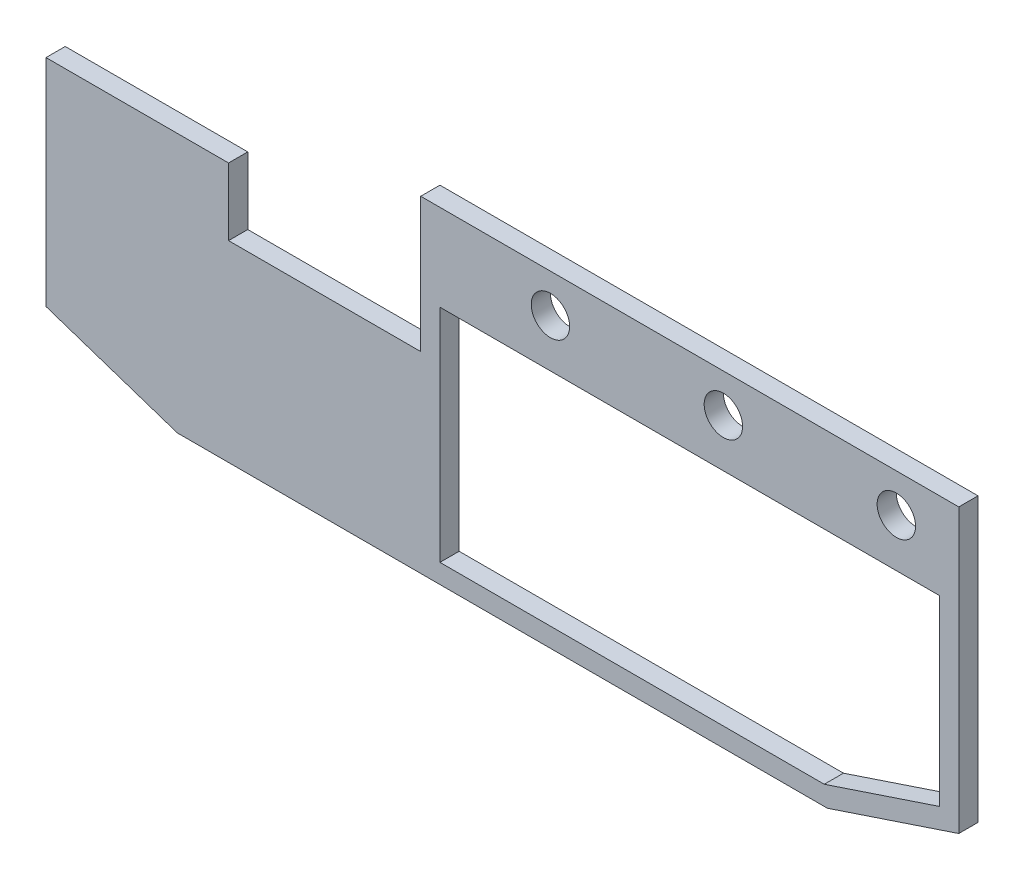
ISO-10303-21;
HEADER;
FILE_DESCRIPTION(('STEP AP214'),'2;1');
FILE_NAME('part.step','',(''),(''),'','','');
FILE_SCHEMA(('AUTOMOTIVE_DESIGN { 1 0 10303 214 1 1 1 1 }'));
ENDSEC;
DATA;
#1=APPLICATION_CONTEXT('core data for automotive mechanical design processes');
#2=APPLICATION_PROTOCOL_DEFINITION('international standard','automotive_design',2000,#1);
#3=PRODUCT_CONTEXT('',#1,'mechanical');
#4=PRODUCT('Part','Part','',(#3));
#5=PRODUCT_RELATED_PRODUCT_CATEGORY('part','',(#4));
#6=PRODUCT_DEFINITION_FORMATION('','',#4);
#7=PRODUCT_DEFINITION_CONTEXT('part definition',#1,'design');
#8=PRODUCT_DEFINITION('design','',#6,#7);
#9=PRODUCT_DEFINITION_SHAPE('','',#8);
#10=(LENGTH_UNIT() NAMED_UNIT(*) SI_UNIT(.MILLI.,.METRE.));
#11=(NAMED_UNIT(*) PLANE_ANGLE_UNIT() SI_UNIT($,.RADIAN.));
#12=(NAMED_UNIT(*) SI_UNIT($,.STERADIAN.) SOLID_ANGLE_UNIT());
#13=UNCERTAINTY_MEASURE_WITH_UNIT(LENGTH_MEASURE(1.E-05),#10,'distance_accuracy_value','');
#14=(GEOMETRIC_REPRESENTATION_CONTEXT(3) GLOBAL_UNCERTAINTY_ASSIGNED_CONTEXT((#13)) GLOBAL_UNIT_ASSIGNED_CONTEXT((#10,
#11,#12)) REPRESENTATION_CONTEXT('',''));
#15=CARTESIAN_POINT('',(0.,0.,0.));
#16=DIRECTION('',(0.,0.,1.));
#17=DIRECTION('',(1.,0.,0.));
#18=AXIS2_PLACEMENT_3D('',#15,#16,#17);
#19=CARTESIAN_POINT('',(2.,-20.4415184401123,-2.));
#20=DIRECTION('',(1.,0.,0.));
#21=DIRECTION('',(0.,0.,-1.));
#22=AXIS2_PLACEMENT_3D('',#19,#20,#21);
#23=PLANE('',#22);
#24=DIRECTION('',(0.,1.,0.));
#25=VECTOR('',#24,1.);
#26=CARTESIAN_POINT('',(2.,-20.4415184401123,0.));
#27=LINE('',#26,#25);
#28=CARTESIAN_POINT('',(2.,-20.4415184401123,0.));
#29=VERTEX_POINT('',#28);
#30=CARTESIAN_POINT('',(2.,9.,0.));
#31=VERTEX_POINT('',#30);
#32=EDGE_CURVE('E223',#29,#31,#27,.T.);
#33=ORIENTED_EDGE('',*,*,#32,.F.);
#34=DIRECTION('',(0.,0.,1.));
#35=VECTOR('',#34,1.);
#36=CARTESIAN_POINT('',(2.,-20.4415184401123,-2.));
#37=LINE('',#36,#35);
#38=CARTESIAN_POINT('',(2.,-20.4415184401123,-2.));
#39=VERTEX_POINT('',#38);
#40=EDGE_CURVE('E11',#39,#29,#37,.T.);
#41=ORIENTED_EDGE('',*,*,#40,.F.);
#42=DIRECTION('',(0.,1.,0.));
#43=VECTOR('',#42,1.);
#44=CARTESIAN_POINT('',(2.,-20.4415184401123,-2.));
#45=LINE('',#44,#43);
#46=CARTESIAN_POINT('',(2.,9.,-2.));
#47=VERTEX_POINT('',#46);
#48=EDGE_CURVE('E224',#39,#47,#45,.T.);
#49=ORIENTED_EDGE('',*,*,#48,.T.);
#50=DIRECTION('',(0.,0.,1.));
#51=VECTOR('',#50,1.);
#52=CARTESIAN_POINT('',(2.,9.,-2.));
#53=LINE('',#52,#51);
#54=EDGE_CURVE('E42',#47,#31,#53,.T.);
#55=ORIENTED_EDGE('',*,*,#54,.T.);
#56=EDGE_LOOP('',(#33,#41,#49,#55));
#57=FACE_BOUND('',#56,.T.);
#58=ADVANCED_FACE('F39',(#57),#23,.T.);
#59=CARTESIAN_POINT('',(-11.6754446796632,-25.,-2.));
#60=DIRECTION('',(0.316227766016838,-0.948683298050514,0.));
#61=DIRECTION('',(0.948683298050514,0.316227766016838,0.));
#62=AXIS2_PLACEMENT_3D('',#59,#60,#61);
#63=PLANE('',#62);
#64=DIRECTION('',(0.948683298050514,0.316227766016838,0.));
#65=VECTOR('',#64,1.);
#66=CARTESIAN_POINT('',(-11.6754446796632,-25.,0.));
#67=LINE('',#66,#65);
#68=CARTESIAN_POINT('',(-11.6754446796632,-25.,0.));
#69=VERTEX_POINT('',#68);
#70=EDGE_CURVE('E229',#69,#29,#67,.T.);
#71=ORIENTED_EDGE('',*,*,#70,.F.);
#72=DIRECTION('',(0.,0.,1.));
#73=VECTOR('',#72,1.);
#74=CARTESIAN_POINT('',(-11.6754446796632,-25.,-2.));
#75=LINE('',#74,#73);
#76=CARTESIAN_POINT('',(-11.6754446796632,-25.,-2.));
#77=VERTEX_POINT('',#76);
#78=EDGE_CURVE('E48',#77,#69,#75,.T.);
#79=ORIENTED_EDGE('',*,*,#78,.F.);
#80=DIRECTION('',(0.948683298050514,0.316227766016838,0.));
#81=VECTOR('',#80,1.);
#82=CARTESIAN_POINT('',(-11.6754446796632,-25.,-2.));
#83=LINE('',#82,#81);
#84=EDGE_CURVE('E261',#77,#39,#83,.T.);
#85=ORIENTED_EDGE('',*,*,#84,.T.);
#86=ORIENTED_EDGE('',*,*,#40,.T.);
#87=EDGE_LOOP('',(#71,#79,#85,#86));
#88=FACE_BOUND('',#87,.T.);
#89=ADVANCED_FACE('F338',(#88),#63,.T.);
#90=CARTESIAN_POINT('',(-79.3245553203368,-25.,-2.));
#91=DIRECTION('',(0.,-1.,0.));
#92=DIRECTION('',(0.,0.,-1.));
#93=AXIS2_PLACEMENT_3D('',#90,#91,#92);
#94=PLANE('',#93);
#95=DIRECTION('',(1.,0.,0.));
#96=VECTOR('',#95,1.);
#97=CARTESIAN_POINT('',(-79.3245553203368,-25.,0.));
#98=LINE('',#97,#96);
#99=CARTESIAN_POINT('',(-79.3245553203368,-25.,0.));
#100=VERTEX_POINT('',#99);
#101=EDGE_CURVE('E296',#100,#69,#98,.T.);
#102=ORIENTED_EDGE('',*,*,#101,.F.);
#103=DIRECTION('',(0.,0.,1.));
#104=VECTOR('',#103,1.);
#105=CARTESIAN_POINT('',(-79.3245553203368,-25.,-2.));
#106=LINE('',#105,#104);
#107=CARTESIAN_POINT('',(-79.3245553203368,-25.,-2.));
#108=VERTEX_POINT('',#107);
#109=EDGE_CURVE('E305',#108,#100,#106,.T.);
#110=ORIENTED_EDGE('',*,*,#109,.F.);
#111=DIRECTION('',(1.,0.,0.));
#112=VECTOR('',#111,1.);
#113=CARTESIAN_POINT('',(-79.3245553203368,-25.,-2.));
#114=LINE('',#113,#112);
#115=EDGE_CURVE('E257',#108,#77,#114,.T.);
#116=ORIENTED_EDGE('',*,*,#115,.T.);
#117=ORIENTED_EDGE('',*,*,#78,.T.);
#118=EDGE_LOOP('',(#102,#110,#116,#117));
#119=FACE_BOUND('',#118,.T.);
#120=ADVANCED_FACE('F366',(#119),#94,.T.);
#121=CARTESIAN_POINT('',(-93.,-20.4415184401123,-2.));
#122=DIRECTION('',(-0.316227766016838,-0.948683298050514,0.));
#123=DIRECTION('',(0.948683298050514,-0.316227766016838,0.));
#124=AXIS2_PLACEMENT_3D('',#121,#122,#123);
#125=PLANE('',#124);
#126=DIRECTION('',(0.948683298050514,-0.316227766016838,0.));
#127=VECTOR('',#126,1.);
#128=CARTESIAN_POINT('',(-93.,-20.4415184401123,0.));
#129=LINE('',#128,#127);
#130=CARTESIAN_POINT('',(-93.,-20.4415184401123,0.));
#131=VERTEX_POINT('',#130);
#132=EDGE_CURVE('E292',#131,#100,#129,.T.);
#133=ORIENTED_EDGE('',*,*,#132,.F.);
#134=DIRECTION('',(0.,0.,1.));
#135=VECTOR('',#134,1.);
#136=CARTESIAN_POINT('',(-93.,-20.4415184401123,-2.));
#137=LINE('',#136,#135);
#138=CARTESIAN_POINT('',(-93.,-20.4415184401123,-2.));
#139=VERTEX_POINT('',#138);
#140=EDGE_CURVE('E308',#139,#131,#137,.T.);
#141=ORIENTED_EDGE('',*,*,#140,.F.);
#142=DIRECTION('',(0.948683298050514,-0.316227766016838,0.));
#143=VECTOR('',#142,1.);
#144=CARTESIAN_POINT('',(-93.,-20.4415184401123,-2.));
#145=LINE('',#144,#143);
#146=EDGE_CURVE('E253',#139,#108,#145,.T.);
#147=ORIENTED_EDGE('',*,*,#146,.T.);
#148=ORIENTED_EDGE('',*,*,#109,.T.);
#149=EDGE_LOOP('',(#133,#141,#147,#148));
#150=FACE_BOUND('',#149,.T.);
#151=ADVANCED_FACE('F364',(#150),#125,.T.);
#152=CARTESIAN_POINT('',(-93.,2.,-2.));
#153=DIRECTION('',(-1.,0.,0.));
#154=DIRECTION('',(0.,0.,1.));
#155=AXIS2_PLACEMENT_3D('',#152,#153,#154);
#156=PLANE('',#155);
#157=DIRECTION('',(0.,-1.,0.));
#158=VECTOR('',#157,1.);
#159=CARTESIAN_POINT('',(-93.,2.,0.));
#160=LINE('',#159,#158);
#161=CARTESIAN_POINT('',(-93.,2.,0.));
#162=VERTEX_POINT('',#161);
#163=EDGE_CURVE('E288',#162,#131,#160,.T.);
#164=ORIENTED_EDGE('',*,*,#163,.F.);
#165=DIRECTION('',(0.,0.,1.));
#166=VECTOR('',#165,1.);
#167=CARTESIAN_POINT('',(-93.,2.,-2.));
#168=LINE('',#167,#166);
#169=CARTESIAN_POINT('',(-93.,2.,-2.));
#170=VERTEX_POINT('',#169);
#171=EDGE_CURVE('E311',#170,#162,#168,.T.);
#172=ORIENTED_EDGE('',*,*,#171,.F.);
#173=DIRECTION('',(0.,-1.,0.));
#174=VECTOR('',#173,1.);
#175=CARTESIAN_POINT('',(-93.,2.,-2.));
#176=LINE('',#175,#174);
#177=EDGE_CURVE('E249',#170,#139,#176,.T.);
#178=ORIENTED_EDGE('',*,*,#177,.T.);
#179=ORIENTED_EDGE('',*,*,#140,.T.);
#180=EDGE_LOOP('',(#164,#172,#178,#179));
#181=FACE_BOUND('',#180,.T.);
#182=ADVANCED_FACE('F360',(#181),#156,.T.);
#183=CARTESIAN_POINT('',(-74.,2.,-2.));
#184=DIRECTION('',(0.,1.,0.));
#185=DIRECTION('',(-1.,0.,0.));
#186=AXIS2_PLACEMENT_3D('',#183,#184,#185);
#187=PLANE('',#186);
#188=DIRECTION('',(-1.,0.,0.));
#189=VECTOR('',#188,1.);
#190=CARTESIAN_POINT('',(-74.,2.,0.));
#191=LINE('',#190,#189);
#192=CARTESIAN_POINT('',(-74.,2.,0.));
#193=VERTEX_POINT('',#192);
#194=EDGE_CURVE('E284',#193,#162,#191,.T.);
#195=ORIENTED_EDGE('',*,*,#194,.F.);
#196=DIRECTION('',(0.,0.,1.));
#197=VECTOR('',#196,1.);
#198=CARTESIAN_POINT('',(-74.,2.,-2.));
#199=LINE('',#198,#197);
#200=CARTESIAN_POINT('',(-74.,2.,-2.));
#201=VERTEX_POINT('',#200);
#202=EDGE_CURVE('E314',#201,#193,#199,.T.);
#203=ORIENTED_EDGE('',*,*,#202,.F.);
#204=DIRECTION('',(-1.,0.,0.));
#205=VECTOR('',#204,1.);
#206=CARTESIAN_POINT('',(-74.,2.,-2.));
#207=LINE('',#206,#205);
#208=EDGE_CURVE('E245',#201,#170,#207,.T.);
#209=ORIENTED_EDGE('',*,*,#208,.T.);
#210=ORIENTED_EDGE('',*,*,#171,.T.);
#211=EDGE_LOOP('',(#195,#203,#209,#210));
#212=FACE_BOUND('',#211,.T.);
#213=ADVANCED_FACE('F356',(#212),#187,.T.);
#214=CARTESIAN_POINT('',(-74.,-5.,-2.));
#215=DIRECTION('',(1.,0.,0.));
#216=DIRECTION('',(0.,0.,-1.));
#217=AXIS2_PLACEMENT_3D('',#214,#215,#216);
#218=PLANE('',#217);
#219=DIRECTION('',(0.,1.,0.));
#220=VECTOR('',#219,1.);
#221=CARTESIAN_POINT('',(-74.,-5.,0.));
#222=LINE('',#221,#220);
#223=CARTESIAN_POINT('',(-74.,-5.,0.));
#224=VERTEX_POINT('',#223);
#225=EDGE_CURVE('E280',#224,#193,#222,.T.);
#226=ORIENTED_EDGE('',*,*,#225,.F.);
#227=DIRECTION('',(0.,0.,1.));
#228=VECTOR('',#227,1.);
#229=CARTESIAN_POINT('',(-74.,-5.,-2.));
#230=LINE('',#229,#228);
#231=CARTESIAN_POINT('',(-74.,-5.,-2.));
#232=VERTEX_POINT('',#231);
#233=EDGE_CURVE('E317',#232,#224,#230,.T.);
#234=ORIENTED_EDGE('',*,*,#233,.F.);
#235=DIRECTION('',(0.,1.,0.));
#236=VECTOR('',#235,1.);
#237=CARTESIAN_POINT('',(-74.,-5.,-2.));
#238=LINE('',#237,#236);
#239=EDGE_CURVE('E241',#232,#201,#238,.T.);
#240=ORIENTED_EDGE('',*,*,#239,.T.);
#241=ORIENTED_EDGE('',*,*,#202,.T.);
#242=EDGE_LOOP('',(#226,#234,#240,#241));
#243=FACE_BOUND('',#242,.T.);
#244=ADVANCED_FACE('F352',(#243),#218,.T.);
#245=CARTESIAN_POINT('',(-54.,-5.,-2.));
#246=DIRECTION('',(0.,1.,0.));
#247=DIRECTION('',(-1.,0.,0.));
#248=AXIS2_PLACEMENT_3D('',#245,#246,#247);
#249=PLANE('',#248);
#250=DIRECTION('',(-1.,0.,0.));
#251=VECTOR('',#250,1.);
#252=CARTESIAN_POINT('',(-54.,-5.,0.));
#253=LINE('',#252,#251);
#254=CARTESIAN_POINT('',(-54.,-5.,0.));
#255=VERTEX_POINT('',#254);
#256=EDGE_CURVE('E276',#255,#224,#253,.T.);
#257=ORIENTED_EDGE('',*,*,#256,.F.);
#258=DIRECTION('',(0.,0.,1.));
#259=VECTOR('',#258,1.);
#260=CARTESIAN_POINT('',(-54.,-5.,-2.));
#261=LINE('',#260,#259);
#262=CARTESIAN_POINT('',(-54.,-5.,-2.));
#263=VERTEX_POINT('',#262);
#264=EDGE_CURVE('E320',#263,#255,#261,.T.);
#265=ORIENTED_EDGE('',*,*,#264,.F.);
#266=DIRECTION('',(-1.,0.,0.));
#267=VECTOR('',#266,1.);
#268=CARTESIAN_POINT('',(-54.,-5.,-2.));
#269=LINE('',#268,#267);
#270=EDGE_CURVE('E237',#263,#232,#269,.T.);
#271=ORIENTED_EDGE('',*,*,#270,.T.);
#272=ORIENTED_EDGE('',*,*,#233,.T.);
#273=EDGE_LOOP('',(#257,#265,#271,#272));
#274=FACE_BOUND('',#273,.T.);
#275=ADVANCED_FACE('F350',(#274),#249,.T.);
#276=CARTESIAN_POINT('',(-54.,8.99999999999999,-2.));
#277=DIRECTION('',(-1.,0.,0.));
#278=DIRECTION('',(0.,0.,1.));
#279=AXIS2_PLACEMENT_3D('',#276,#277,#278);
#280=PLANE('',#279);
#281=DIRECTION('',(0.,-1.,0.));
#282=VECTOR('',#281,1.);
#283=CARTESIAN_POINT('',(-54.,8.99999999999999,0.));
#284=LINE('',#283,#282);
#285=CARTESIAN_POINT('',(-54.,8.99999999999999,0.));
#286=VERTEX_POINT('',#285);
#287=EDGE_CURVE('E272',#286,#255,#284,.T.);
#288=ORIENTED_EDGE('',*,*,#287,.F.);
#289=DIRECTION('',(0.,0.,1.));
#290=VECTOR('',#289,1.);
#291=CARTESIAN_POINT('',(-54.,8.99999999999999,-2.));
#292=LINE('',#291,#290);
#293=CARTESIAN_POINT('',(-54.,8.99999999999999,-2.));
#294=VERTEX_POINT('',#293);
#295=EDGE_CURVE('E322',#294,#286,#292,.T.);
#296=ORIENTED_EDGE('',*,*,#295,.F.);
#297=DIRECTION('',(0.,-1.,0.));
#298=VECTOR('',#297,1.);
#299=CARTESIAN_POINT('',(-54.,8.99999999999999,-2.));
#300=LINE('',#299,#298);
#301=EDGE_CURVE('E233',#294,#263,#300,.T.);
#302=ORIENTED_EDGE('',*,*,#301,.T.);
#303=ORIENTED_EDGE('',*,*,#264,.T.);
#304=EDGE_LOOP('',(#288,#296,#302,#303));
#305=FACE_BOUND('',#304,.T.);
#306=ADVANCED_FACE('F346',(#305),#280,.T.);
#307=CARTESIAN_POINT('',(2.,9.,-2.));
#308=DIRECTION('',(0.,1.,0.));
#309=DIRECTION('',(-1.,0.,0.));
#310=AXIS2_PLACEMENT_3D('',#307,#308,#309);
#311=PLANE('',#310);
#312=DIRECTION('',(-1.,0.,0.));
#313=VECTOR('',#312,1.);
#314=CARTESIAN_POINT('',(2.,9.,0.));
#315=LINE('',#314,#313);
#316=EDGE_CURVE('E268',#31,#286,#315,.T.);
#317=ORIENTED_EDGE('',*,*,#316,.F.);
#318=ORIENTED_EDGE('',*,*,#54,.F.);
#319=DIRECTION('',(-1.,0.,0.));
#320=VECTOR('',#319,1.);
#321=CARTESIAN_POINT('',(2.,9.,-2.));
#322=LINE('',#321,#320);
#323=EDGE_CURVE('E228',#47,#294,#322,.T.);
#324=ORIENTED_EDGE('',*,*,#323,.T.);
#325=ORIENTED_EDGE('',*,*,#295,.T.);
#326=EDGE_LOOP('',(#317,#318,#324,#325));
#327=FACE_BOUND('',#326,.T.);
#328=ADVANCED_FACE('F332',(#327),#311,.T.);
#329=CARTESIAN_POINT('',(0.,0.,-2.));
#330=DIRECTION('',(0.,0.,1.));
#331=DIRECTION('',(1.,0.,0.));
#332=AXIS2_PLACEMENT_3D('',#329,#330,#331);
#333=PLANE('',#332);
#334=DIRECTION('',(0.,-1.,0.));
#335=VECTOR('',#334,1.);
#336=CARTESIAN_POINT('',(0.,0.,-2.));
#337=LINE('',#336,#335);
#338=CARTESIAN_POINT('',(0.,0.,-2.));
#339=VERTEX_POINT('',#338);
#340=CARTESIAN_POINT('',(0.,-19.,-2.));
#341=VERTEX_POINT('',#340);
#342=EDGE_CURVE('E170',#339,#341,#337,.T.);
#343=ORIENTED_EDGE('',*,*,#342,.F.);
#344=DIRECTION('',(1.,0.,0.));
#345=VECTOR('',#344,1.);
#346=CARTESIAN_POINT('',(-52.,0.,-2.));
#347=LINE('',#346,#345);
#348=CARTESIAN_POINT('',(-52.,0.,-2.));
#349=VERTEX_POINT('',#348);
#350=EDGE_CURVE('E152',#349,#339,#347,.T.);
#351=ORIENTED_EDGE('',*,*,#350,.F.);
#352=DIRECTION('',(0.,1.,0.));
#353=VECTOR('',#352,1.);
#354=CARTESIAN_POINT('',(-52.,-7.,-2.));
#355=LINE('',#354,#353);
#356=CARTESIAN_POINT('',(-52.,-23.,-2.));
#357=VERTEX_POINT('',#356);
#358=EDGE_CURVE('E64',#357,#349,#355,.T.);
#359=ORIENTED_EDGE('',*,*,#358,.F.);
#360=DIRECTION('',(-1.,0.,0.));
#361=VECTOR('',#360,1.);
#362=CARTESIAN_POINT('',(-12.,-23.,-2.));
#363=LINE('',#362,#361);
#364=CARTESIAN_POINT('',(-12.,-23.,-2.));
#365=VERTEX_POINT('',#364);
#366=EDGE_CURVE('E541',#365,#357,#363,.T.);
#367=ORIENTED_EDGE('',*,*,#366,.F.);
#368=DIRECTION('',(-0.948683298050514,-0.316227766016838,0.));
#369=VECTOR('',#368,1.);
#370=CARTESIAN_POINT('',(0.,-19.,-2.));
#371=LINE('',#370,#369);
#372=EDGE_CURVE('E176',#341,#365,#371,.T.);
#373=ORIENTED_EDGE('',*,*,#372,.F.);
#374=EDGE_LOOP('',(#343,#351,#359,#367,#373));
#375=FACE_BOUND('',#374,.T.);
#376=CARTESIAN_POINT('',(-40.5,5.,-2.));
#377=DIRECTION('',(0.,0.,1.));
#378=DIRECTION('',(1.,0.,0.));
#379=AXIS2_PLACEMENT_3D('',#376,#377,#378);
#380=CIRCLE('',#379,1.99999999999999);
#381=CARTESIAN_POINT('',(-38.5,5.,-2.));
#382=VERTEX_POINT('',#381);
#383=EDGE_CURVE('E203',#382,#382,#380,.T.);
#384=ORIENTED_EDGE('',*,*,#383,.T.);
#385=EDGE_LOOP('',(#384));
#386=FACE_BOUND('',#385,.T.);
#387=CARTESIAN_POINT('',(-22.5,5.,-2.));
#388=DIRECTION('',(0.,0.,1.));
#389=DIRECTION('',(1.,0.,0.));
#390=AXIS2_PLACEMENT_3D('',#387,#388,#389);
#391=CIRCLE('',#390,1.99999999999999);
#392=CARTESIAN_POINT('',(-20.5,5.,-2.));
#393=VERTEX_POINT('',#392);
#394=EDGE_CURVE('E211',#393,#393,#391,.T.);
#395=ORIENTED_EDGE('',*,*,#394,.T.);
#396=EDGE_LOOP('',(#395));
#397=FACE_BOUND('',#396,.T.);
#398=CARTESIAN_POINT('',(-4.5,5.,-2.));
#399=DIRECTION('',(0.,0.,1.));
#400=DIRECTION('',(1.,0.,0.));
#401=AXIS2_PLACEMENT_3D('',#398,#399,#400);
#402=CIRCLE('',#401,1.99999999999999);
#403=CARTESIAN_POINT('',(-2.5,5.,-2.));
#404=VERTEX_POINT('',#403);
#405=EDGE_CURVE('E219',#404,#404,#402,.T.);
#406=ORIENTED_EDGE('',*,*,#405,.T.);
#407=EDGE_LOOP('',(#406));
#408=FACE_BOUND('',#407,.T.);
#409=ORIENTED_EDGE('',*,*,#48,.F.);
#410=ORIENTED_EDGE('',*,*,#84,.F.);
#411=ORIENTED_EDGE('',*,*,#115,.F.);
#412=ORIENTED_EDGE('',*,*,#146,.F.);
#413=ORIENTED_EDGE('',*,*,#177,.F.);
#414=ORIENTED_EDGE('',*,*,#208,.F.);
#415=ORIENTED_EDGE('',*,*,#239,.F.);
#416=ORIENTED_EDGE('',*,*,#270,.F.);
#417=ORIENTED_EDGE('',*,*,#301,.F.);
#418=ORIENTED_EDGE('',*,*,#323,.F.);
#419=EDGE_LOOP('',(#409,#410,#411,#412,#413,#414,#415,#416,#417,#418));
#420=FACE_BOUND('',#419,.T.);
#421=ADVANCED_FACE('F166',(#375,#386,#397,#408,#420),#333,.F.);
#422=CARTESIAN_POINT('',(0.,0.,0.));
#423=DIRECTION('',(0.,0.,1.));
#424=DIRECTION('',(1.,0.,0.));
#425=AXIS2_PLACEMENT_3D('',#422,#423,#424);
#426=PLANE('',#425);
#427=DIRECTION('',(1.,0.,0.));
#428=VECTOR('',#427,1.);
#429=CARTESIAN_POINT('',(-12.,-23.,0.));
#430=LINE('',#429,#428);
#431=CARTESIAN_POINT('',(-52.,-23.,0.));
#432=VERTEX_POINT('',#431);
#433=CARTESIAN_POINT('',(-12.,-23.,0.));
#434=VERTEX_POINT('',#433);
#435=EDGE_CURVE('E182',#432,#434,#430,.T.);
#436=ORIENTED_EDGE('',*,*,#435,.F.);
#437=DIRECTION('',(0.,-1.,0.));
#438=VECTOR('',#437,1.);
#439=CARTESIAN_POINT('',(-52.,-7.,0.));
#440=LINE('',#439,#438);
#441=CARTESIAN_POINT('',(-52.,0.,0.));
#442=VERTEX_POINT('',#441);
#443=EDGE_CURVE('E56',#442,#432,#440,.T.);
#444=ORIENTED_EDGE('',*,*,#443,.F.);
#445=DIRECTION('',(-1.,0.,0.));
#446=VECTOR('',#445,1.);
#447=CARTESIAN_POINT('',(-52.,0.,0.));
#448=LINE('',#447,#446);
#449=CARTESIAN_POINT('',(0.,0.,0.));
#450=VERTEX_POINT('',#449);
#451=EDGE_CURVE('E155',#450,#442,#448,.T.);
#452=ORIENTED_EDGE('',*,*,#451,.F.);
#453=DIRECTION('',(0.,1.,0.));
#454=VECTOR('',#453,1.);
#455=CARTESIAN_POINT('',(0.,0.,0.));
#456=LINE('',#455,#454);
#457=CARTESIAN_POINT('',(0.,-19.,0.));
#458=VERTEX_POINT('',#457);
#459=EDGE_CURVE('E158',#458,#450,#456,.T.);
#460=ORIENTED_EDGE('',*,*,#459,.F.);
#461=DIRECTION('',(0.948683298050514,0.316227766016838,0.));
#462=VECTOR('',#461,1.);
#463=CARTESIAN_POINT('',(0.,-19.,0.));
#464=LINE('',#463,#462);
#465=EDGE_CURVE('E185',#434,#458,#464,.T.);
#466=ORIENTED_EDGE('',*,*,#465,.F.);
#467=EDGE_LOOP('',(#436,#444,#452,#460,#466));
#468=FACE_BOUND('',#467,.T.);
#469=CARTESIAN_POINT('',(-40.5,5.,0.));
#470=DIRECTION('',(0.,0.,1.));
#471=DIRECTION('',(1.,0.,0.));
#472=AXIS2_PLACEMENT_3D('',#469,#470,#471);
#473=CIRCLE('',#472,1.99999999999999);
#474=CARTESIAN_POINT('',(-38.5,5.,0.));
#475=VERTEX_POINT('',#474);
#476=EDGE_CURVE('E163',#475,#475,#473,.T.);
#477=ORIENTED_EDGE('',*,*,#476,.F.);
#478=EDGE_LOOP('',(#477));
#479=FACE_BOUND('',#478,.T.);
#480=CARTESIAN_POINT('',(-22.5,5.,0.));
#481=DIRECTION('',(0.,0.,1.));
#482=DIRECTION('',(1.,0.,0.));
#483=AXIS2_PLACEMENT_3D('',#480,#481,#482);
#484=CIRCLE('',#483,1.99999999999999);
#485=CARTESIAN_POINT('',(-20.5,5.,0.));
#486=VERTEX_POINT('',#485);
#487=EDGE_CURVE('E207',#486,#486,#484,.T.);
#488=ORIENTED_EDGE('',*,*,#487,.F.);
#489=EDGE_LOOP('',(#488));
#490=FACE_BOUND('',#489,.T.);
#491=CARTESIAN_POINT('',(-4.5,5.,0.));
#492=DIRECTION('',(0.,0.,1.));
#493=DIRECTION('',(1.,0.,0.));
#494=AXIS2_PLACEMENT_3D('',#491,#492,#493);
#495=CIRCLE('',#494,1.99999999999999);
#496=CARTESIAN_POINT('',(-2.50000000000001,5.,0.));
#497=VERTEX_POINT('',#496);
#498=EDGE_CURVE('E215',#497,#497,#495,.T.);
#499=ORIENTED_EDGE('',*,*,#498,.F.);
#500=EDGE_LOOP('',(#499));
#501=FACE_BOUND('',#500,.T.);
#502=ORIENTED_EDGE('',*,*,#32,.T.);
#503=ORIENTED_EDGE('',*,*,#316,.T.);
#504=ORIENTED_EDGE('',*,*,#287,.T.);
#505=ORIENTED_EDGE('',*,*,#256,.T.);
#506=ORIENTED_EDGE('',*,*,#225,.T.);
#507=ORIENTED_EDGE('',*,*,#194,.T.);
#508=ORIENTED_EDGE('',*,*,#163,.T.);
#509=ORIENTED_EDGE('',*,*,#132,.T.);
#510=ORIENTED_EDGE('',*,*,#101,.T.);
#511=ORIENTED_EDGE('',*,*,#70,.T.);
#512=EDGE_LOOP('',(#502,#503,#504,#505,#506,#507,#508,#509,#510,#511));
#513=FACE_BOUND('',#512,.T.);
#514=ADVANCED_FACE('F334',(#468,#479,#490,#501,#513),#426,.T.);
#515=CARTESIAN_POINT('',(-4.5,5.,0.));
#516=DIRECTION('',(0.,0.,1.));
#517=DIRECTION('',(1.,0.,0.));
#518=AXIS2_PLACEMENT_3D('',#515,#516,#517);
#519=CYLINDRICAL_SURFACE('',#518,1.99999999999999);
#520=ORIENTED_EDGE('',*,*,#405,.F.);
#521=EDGE_LOOP('',(#520));
#522=FACE_BOUND('',#521,.T.);
#523=ORIENTED_EDGE('',*,*,#498,.T.);
#524=EDGE_LOOP('',(#523));
#525=FACE_BOUND('',#524,.T.);
#526=ADVANCED_FACE('F446',(#522,#525),#519,.F.);
#527=CARTESIAN_POINT('',(-22.5,5.,0.));
#528=DIRECTION('',(0.,0.,1.));
#529=DIRECTION('',(1.,0.,0.));
#530=AXIS2_PLACEMENT_3D('',#527,#528,#529);
#531=CYLINDRICAL_SURFACE('',#530,1.99999999999999);
#532=ORIENTED_EDGE('',*,*,#394,.F.);
#533=EDGE_LOOP('',(#532));
#534=FACE_BOUND('',#533,.T.);
#535=ORIENTED_EDGE('',*,*,#487,.T.);
#536=EDGE_LOOP('',(#535));
#537=FACE_BOUND('',#536,.T.);
#538=ADVANCED_FACE('F451',(#534,#537),#531,.F.);
#539=CARTESIAN_POINT('',(-40.5,5.,0.));
#540=DIRECTION('',(0.,0.,1.));
#541=DIRECTION('',(1.,0.,0.));
#542=AXIS2_PLACEMENT_3D('',#539,#540,#541);
#543=CYLINDRICAL_SURFACE('',#542,1.99999999999999);
#544=ORIENTED_EDGE('',*,*,#383,.F.);
#545=EDGE_LOOP('',(#544));
#546=FACE_BOUND('',#545,.T.);
#547=ORIENTED_EDGE('',*,*,#476,.T.);
#548=EDGE_LOOP('',(#547));
#549=FACE_BOUND('',#548,.T.);
#550=ADVANCED_FACE('F463',(#546,#549),#543,.F.);
#551=CARTESIAN_POINT('',(-52.,0.,-2.001));
#552=DIRECTION('',(0.,1.,0.));
#553=DIRECTION('',(0.,0.,1.));
#554=AXIS2_PLACEMENT_3D('',#551,#552,#553);
#555=PLANE('',#554);
#556=ORIENTED_EDGE('',*,*,#350,.T.);
#557=DIRECTION('',(0.,0.,1.));
#558=VECTOR('',#557,1.);
#559=CARTESIAN_POINT('',(0.,0.,-2.001));
#560=LINE('',#559,#558);
#561=EDGE_CURVE('E164',#339,#450,#560,.T.);
#562=ORIENTED_EDGE('',*,*,#561,.T.);
#563=ORIENTED_EDGE('',*,*,#451,.T.);
#564=DIRECTION('',(0.,0.,1.));
#565=VECTOR('',#564,1.);
#566=CARTESIAN_POINT('',(-52.,0.,-2.001));
#567=LINE('',#566,#565);
#568=EDGE_CURVE('E150',#349,#442,#567,.T.);
#569=ORIENTED_EDGE('',*,*,#568,.F.);
#570=EDGE_LOOP('',(#556,#562,#563,#569));
#571=FACE_BOUND('',#570,.T.);
#572=ADVANCED_FACE('F151',(#571),#555,.F.);
#573=CARTESIAN_POINT('',(0.,0.,-2.001));
#574=DIRECTION('',(1.,0.,0.));
#575=DIRECTION('',(0.,1.,0.));
#576=AXIS2_PLACEMENT_3D('',#573,#574,#575);
#577=PLANE('',#576);
#578=ORIENTED_EDGE('',*,*,#342,.T.);
#579=DIRECTION('',(0.,0.,1.));
#580=VECTOR('',#579,1.);
#581=CARTESIAN_POINT('',(0.,-19.,-2.001));
#582=LINE('',#581,#580);
#583=EDGE_CURVE('E194',#341,#458,#582,.T.);
#584=ORIENTED_EDGE('',*,*,#583,.T.);
#585=ORIENTED_EDGE('',*,*,#459,.T.);
#586=ORIENTED_EDGE('',*,*,#561,.F.);
#587=EDGE_LOOP('',(#578,#584,#585,#586));
#588=FACE_BOUND('',#587,.T.);
#589=ADVANCED_FACE('F482',(#588),#577,.F.);
#590=CARTESIAN_POINT('',(0.,-19.,-2.001));
#591=DIRECTION('',(0.316227766016838,-0.948683298050514,0.));
#592=DIRECTION('',(0.948683298050514,0.316227766016838,0.));
#593=AXIS2_PLACEMENT_3D('',#590,#591,#592);
#594=PLANE('',#593);
#595=ORIENTED_EDGE('',*,*,#372,.T.);
#596=DIRECTION('',(0.,0.,1.));
#597=VECTOR('',#596,1.);
#598=CARTESIAN_POINT('',(-12.,-23.,-2.001));
#599=LINE('',#598,#597);
#600=EDGE_CURVE('E157',#365,#434,#599,.T.);
#601=ORIENTED_EDGE('',*,*,#600,.T.);
#602=ORIENTED_EDGE('',*,*,#465,.T.);
#603=ORIENTED_EDGE('',*,*,#583,.F.);
#604=EDGE_LOOP('',(#595,#601,#602,#603));
#605=FACE_BOUND('',#604,.T.);
#606=ADVANCED_FACE('F491',(#605),#594,.F.);
#607=CARTESIAN_POINT('',(-12.,-23.,-2.001));
#608=DIRECTION('',(0.,-1.,0.));
#609=DIRECTION('',(1.,0.,0.));
#610=AXIS2_PLACEMENT_3D('',#607,#608,#609);
#611=PLANE('',#610);
#612=ORIENTED_EDGE('',*,*,#366,.T.);
#613=DIRECTION('',(0.,0.,1.));
#614=VECTOR('',#613,1.);
#615=CARTESIAN_POINT('',(-52.,-23.,-47.2769256906871));
#616=LINE('',#615,#614);
#617=EDGE_CURVE('E161',#357,#432,#616,.T.);
#618=ORIENTED_EDGE('',*,*,#617,.T.);
#619=ORIENTED_EDGE('',*,*,#435,.T.);
#620=ORIENTED_EDGE('',*,*,#600,.F.);
#621=EDGE_LOOP('',(#612,#618,#619,#620));
#622=FACE_BOUND('',#621,.T.);
#623=ADVANCED_FACE('F501',(#622),#611,.F.);
#624=CARTESIAN_POINT('',(-52.,-7.,-2.001));
#625=DIRECTION('',(-1.,0.,0.));
#626=DIRECTION('',(0.,0.,1.));
#627=AXIS2_PLACEMENT_3D('',#624,#625,#626);
#628=PLANE('',#627);
#629=ORIENTED_EDGE('',*,*,#358,.T.);
#630=ORIENTED_EDGE('',*,*,#568,.T.);
#631=ORIENTED_EDGE('',*,*,#443,.T.);
#632=ORIENTED_EDGE('',*,*,#617,.F.);
#633=EDGE_LOOP('',(#629,#630,#631,#632));
#634=FACE_BOUND('',#633,.T.);
#635=ADVANCED_FACE('F160',(#634),#628,.F.);
#636=CLOSED_SHELL('',(#58,#89,#120,#151,#182,#213,#244,#275,#306,#328,#421,#514,#526,#538,#550,
#572,#589,#606,#623,#635));
#637=MANIFOLD_SOLID_BREP('B2',#636);
#638=ADVANCED_BREP_SHAPE_REPRESENTATION('',(#18,#637),#14);
#639=SHAPE_DEFINITION_REPRESENTATION(#9,#638);
ENDSEC;
END-ISO-10303-21;
